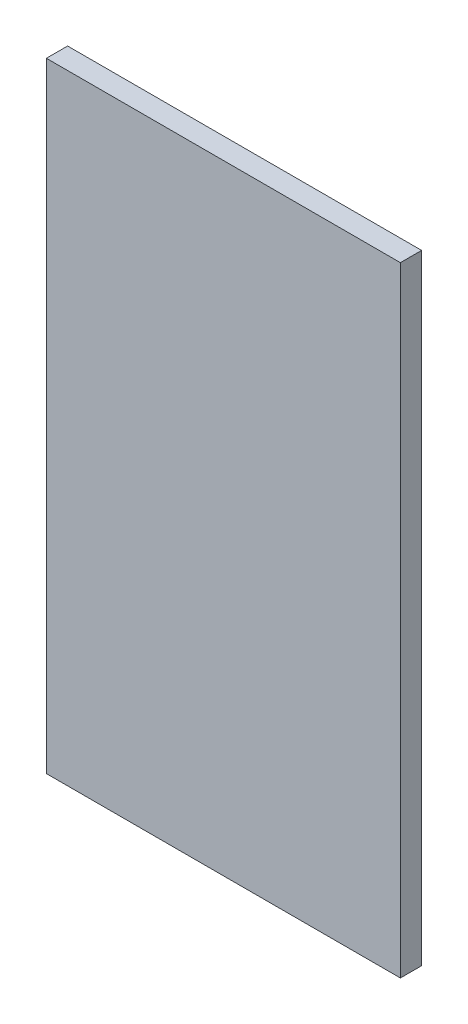
ISO-10303-21;
HEADER;
FILE_DESCRIPTION(('STEP AP214'),'2;1');
FILE_NAME('part.step','',(''),(''),'','','');
FILE_SCHEMA(('AUTOMOTIVE_DESIGN { 1 0 10303 214 1 1 1 1 }'));
ENDSEC;
DATA;
#1=APPLICATION_CONTEXT('core data for automotive mechanical design processes');
#2=APPLICATION_PROTOCOL_DEFINITION('international standard','automotive_design',2000,#1);
#3=PRODUCT_CONTEXT('',#1,'mechanical');
#4=PRODUCT('Part','Part','',(#3));
#5=PRODUCT_RELATED_PRODUCT_CATEGORY('part','',(#4));
#6=PRODUCT_DEFINITION_FORMATION('','',#4);
#7=PRODUCT_DEFINITION_CONTEXT('part definition',#1,'design');
#8=PRODUCT_DEFINITION('design','',#6,#7);
#9=PRODUCT_DEFINITION_SHAPE('','',#8);
#10=(LENGTH_UNIT() NAMED_UNIT(*) SI_UNIT(.MILLI.,.METRE.));
#11=(NAMED_UNIT(*) PLANE_ANGLE_UNIT() SI_UNIT($,.RADIAN.));
#12=(NAMED_UNIT(*) SI_UNIT($,.STERADIAN.) SOLID_ANGLE_UNIT());
#13=UNCERTAINTY_MEASURE_WITH_UNIT(LENGTH_MEASURE(1.E-05),#10,'distance_accuracy_value','');
#14=(GEOMETRIC_REPRESENTATION_CONTEXT(3) GLOBAL_UNCERTAINTY_ASSIGNED_CONTEXT((#13)) GLOBAL_UNIT_ASSIGNED_CONTEXT((#10,
#11,#12)) REPRESENTATION_CONTEXT('',''));
#15=CARTESIAN_POINT('',(0.,0.,0.));
#16=DIRECTION('',(0.,0.,1.));
#17=DIRECTION('',(1.,0.,0.));
#18=AXIS2_PLACEMENT_3D('',#15,#16,#17);
#19=CARTESIAN_POINT('',(50.,-87.5,6.));
#20=DIRECTION('',(-1.,0.,0.));
#21=DIRECTION('',(0.,0.,1.));
#22=AXIS2_PLACEMENT_3D('',#19,#20,#21);
#23=PLANE('',#22);
#24=DIRECTION('',(0.,1.,0.));
#25=VECTOR('',#24,1.);
#26=CARTESIAN_POINT('',(50.,-87.5,0.));
#27=LINE('',#26,#25);
#28=CARTESIAN_POINT('',(50.,-87.5,0.));
#29=VERTEX_POINT('',#28);
#30=CARTESIAN_POINT('',(50.,87.5,0.));
#31=VERTEX_POINT('',#30);
#32=EDGE_CURVE('E107',#29,#31,#27,.T.);
#33=ORIENTED_EDGE('',*,*,#32,.T.);
#34=DIRECTION('',(0.,0.,-1.));
#35=VECTOR('',#34,1.);
#36=CARTESIAN_POINT('',(50.,87.5,6.));
#37=LINE('',#36,#35);
#38=CARTESIAN_POINT('',(50.,87.5,6.));
#39=VERTEX_POINT('',#38);
#40=EDGE_CURVE('E11',#39,#31,#37,.T.);
#41=ORIENTED_EDGE('',*,*,#40,.F.);
#42=DIRECTION('',(0.,1.,0.));
#43=VECTOR('',#42,1.);
#44=CARTESIAN_POINT('',(50.,-87.5,6.));
#45=LINE('',#44,#43);
#46=CARTESIAN_POINT('',(50.,-87.5,6.));
#47=VERTEX_POINT('',#46);
#48=EDGE_CURVE('E91',#47,#39,#45,.T.);
#49=ORIENTED_EDGE('',*,*,#48,.F.);
#50=DIRECTION('',(0.,0.,-1.));
#51=VECTOR('',#50,1.);
#52=CARTESIAN_POINT('',(50.,-87.5,6.));
#53=LINE('',#52,#51);
#54=EDGE_CURVE('E103',#47,#29,#53,.T.);
#55=ORIENTED_EDGE('',*,*,#54,.T.);
#56=EDGE_LOOP('',(#33,#41,#49,#55));
#57=FACE_BOUND('',#56,.T.);
#58=ADVANCED_FACE('F39',(#57),#23,.F.);
#59=CARTESIAN_POINT('',(-50.,87.5,6.));
#60=DIRECTION('',(0.,-1.,0.));
#61=DIRECTION('',(0.,0.,-1.));
#62=AXIS2_PLACEMENT_3D('',#59,#60,#61);
#63=PLANE('',#62);
#64=DIRECTION('',(-1.,0.,0.));
#65=VECTOR('',#64,1.);
#66=CARTESIAN_POINT('',(-50.,87.5,0.));
#67=LINE('',#66,#65);
#68=CARTESIAN_POINT('',(-50.,87.5,0.));
#69=VERTEX_POINT('',#68);
#70=EDGE_CURVE('E96',#31,#69,#67,.T.);
#71=ORIENTED_EDGE('',*,*,#70,.T.);
#72=DIRECTION('',(0.,0.,-1.));
#73=VECTOR('',#72,1.);
#74=CARTESIAN_POINT('',(-50.,87.5,6.));
#75=LINE('',#74,#73);
#76=CARTESIAN_POINT('',(-50.,87.5,6.));
#77=VERTEX_POINT('',#76);
#78=EDGE_CURVE('E48',#77,#69,#75,.T.);
#79=ORIENTED_EDGE('',*,*,#78,.F.);
#80=DIRECTION('',(-1.,0.,0.));
#81=VECTOR('',#80,1.);
#82=CARTESIAN_POINT('',(-50.,87.5,6.));
#83=LINE('',#82,#81);
#84=EDGE_CURVE('E86',#39,#77,#83,.T.);
#85=ORIENTED_EDGE('',*,*,#84,.F.);
#86=ORIENTED_EDGE('',*,*,#40,.T.);
#87=EDGE_LOOP('',(#71,#79,#85,#86));
#88=FACE_BOUND('',#87,.T.);
#89=ADVANCED_FACE('F95',(#88),#63,.F.);
#90=CARTESIAN_POINT('',(-50.,-87.5,6.));
#91=DIRECTION('',(1.,0.,0.));
#92=DIRECTION('',(0.,0.,-1.));
#93=AXIS2_PLACEMENT_3D('',#90,#91,#92);
#94=PLANE('',#93);
#95=DIRECTION('',(0.,-1.,0.));
#96=VECTOR('',#95,1.);
#97=CARTESIAN_POINT('',(-50.,-87.5,0.));
#98=LINE('',#97,#96);
#99=CARTESIAN_POINT('',(-50.,-87.5,0.));
#100=VERTEX_POINT('',#99);
#101=EDGE_CURVE('E73',#69,#100,#98,.T.);
#102=ORIENTED_EDGE('',*,*,#101,.T.);
#103=DIRECTION('',(0.,0.,-1.));
#104=VECTOR('',#103,1.);
#105=CARTESIAN_POINT('',(-50.,-87.5,6.));
#106=LINE('',#105,#104);
#107=CARTESIAN_POINT('',(-50.,-87.5,6.));
#108=VERTEX_POINT('',#107);
#109=EDGE_CURVE('E98',#108,#100,#106,.T.);
#110=ORIENTED_EDGE('',*,*,#109,.F.);
#111=DIRECTION('',(0.,-1.,0.));
#112=VECTOR('',#111,1.);
#113=CARTESIAN_POINT('',(-50.,-87.5,6.));
#114=LINE('',#113,#112);
#115=EDGE_CURVE('E89',#77,#108,#114,.T.);
#116=ORIENTED_EDGE('',*,*,#115,.F.);
#117=ORIENTED_EDGE('',*,*,#78,.T.);
#118=EDGE_LOOP('',(#102,#110,#116,#117));
#119=FACE_BOUND('',#118,.T.);
#120=ADVANCED_FACE('F99',(#119),#94,.F.);
#121=CARTESIAN_POINT('',(-50.,-87.5,6.));
#122=DIRECTION('',(0.,1.,0.));
#123=DIRECTION('',(0.,0.,1.));
#124=AXIS2_PLACEMENT_3D('',#121,#122,#123);
#125=PLANE('',#124);
#126=DIRECTION('',(1.,0.,0.));
#127=VECTOR('',#126,1.);
#128=CARTESIAN_POINT('',(-50.,-87.5,0.));
#129=LINE('',#128,#127);
#130=EDGE_CURVE('E79',#100,#29,#129,.T.);
#131=ORIENTED_EDGE('',*,*,#130,.T.);
#132=ORIENTED_EDGE('',*,*,#54,.F.);
#133=DIRECTION('',(1.,0.,0.));
#134=VECTOR('',#133,1.);
#135=CARTESIAN_POINT('',(-50.,-87.5,6.));
#136=LINE('',#135,#134);
#137=EDGE_CURVE('E56',#108,#47,#136,.T.);
#138=ORIENTED_EDGE('',*,*,#137,.F.);
#139=ORIENTED_EDGE('',*,*,#109,.T.);
#140=EDGE_LOOP('',(#131,#132,#138,#139));
#141=FACE_BOUND('',#140,.T.);
#142=ADVANCED_FACE('F120',(#141),#125,.F.);
#143=CARTESIAN_POINT('',(0.,0.,6.));
#144=DIRECTION('',(0.,0.,-1.));
#145=DIRECTION('',(-1.,0.,0.));
#146=AXIS2_PLACEMENT_3D('',#143,#144,#145);
#147=PLANE('',#146);
#148=ORIENTED_EDGE('',*,*,#48,.T.);
#149=ORIENTED_EDGE('',*,*,#84,.T.);
#150=ORIENTED_EDGE('',*,*,#115,.T.);
#151=ORIENTED_EDGE('',*,*,#137,.T.);
#152=EDGE_LOOP('',(#148,#149,#150,#151));
#153=FACE_BOUND('',#152,.T.);
#154=ADVANCED_FACE('F87',(#153),#147,.F.);
#155=CARTESIAN_POINT('',(0.,0.,0.));
#156=DIRECTION('',(0.,0.,-1.));
#157=DIRECTION('',(-1.,0.,0.));
#158=AXIS2_PLACEMENT_3D('',#155,#156,#157);
#159=PLANE('',#158);
#160=ORIENTED_EDGE('',*,*,#32,.F.);
#161=ORIENTED_EDGE('',*,*,#130,.F.);
#162=ORIENTED_EDGE('',*,*,#101,.F.);
#163=ORIENTED_EDGE('',*,*,#70,.F.);
#164=EDGE_LOOP('',(#160,#161,#162,#163));
#165=FACE_BOUND('',#164,.T.);
#166=ADVANCED_FACE('F123',(#165),#159,.T.);
#167=CLOSED_SHELL('',(#58,#89,#120,#142,#154,#166));
#168=MANIFOLD_SOLID_BREP('B2',#167);
#169=ADVANCED_BREP_SHAPE_REPRESENTATION('',(#18,#168),#14);
#170=SHAPE_DEFINITION_REPRESENTATION(#9,#169);
ENDSEC;
END-ISO-10303-21;
